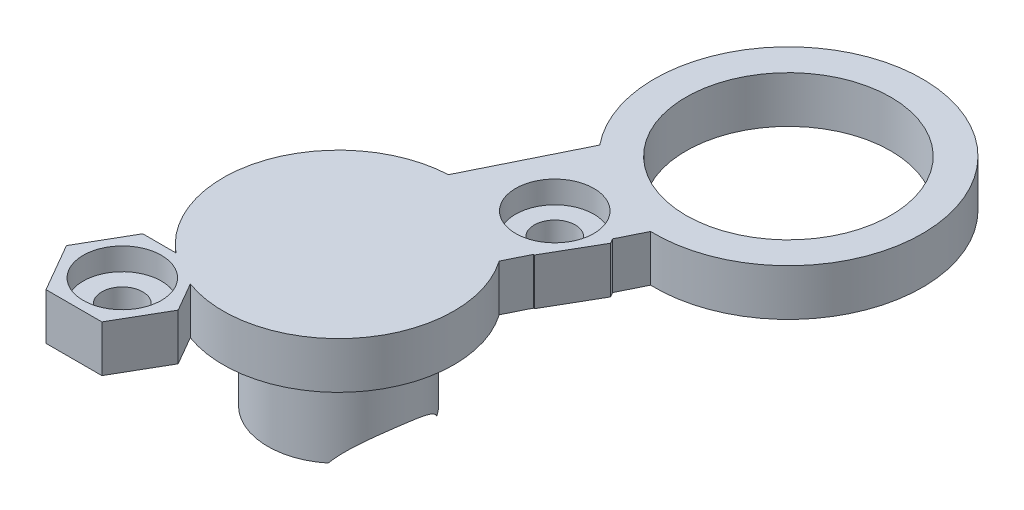
ISO-10303-21;
HEADER;
FILE_DESCRIPTION(('STEP AP214'),'2;1');
FILE_NAME('part.step','',(''),(''),'','','');
FILE_SCHEMA(('AUTOMOTIVE_DESIGN { 1 0 10303 214 1 1 1 1 }'));
ENDSEC;
DATA;
#1=APPLICATION_CONTEXT('core data for automotive mechanical design processes');
#2=APPLICATION_PROTOCOL_DEFINITION('international standard','automotive_design',2000,#1);
#3=PRODUCT_CONTEXT('',#1,'mechanical');
#4=PRODUCT('Part','Part','',(#3));
#5=PRODUCT_RELATED_PRODUCT_CATEGORY('part','',(#4));
#6=PRODUCT_DEFINITION_FORMATION('','',#4);
#7=PRODUCT_DEFINITION_CONTEXT('part definition',#1,'design');
#8=PRODUCT_DEFINITION('design','',#6,#7);
#9=PRODUCT_DEFINITION_SHAPE('','',#8);
#10=(LENGTH_UNIT() NAMED_UNIT(*) SI_UNIT(.MILLI.,.METRE.));
#11=(NAMED_UNIT(*) PLANE_ANGLE_UNIT() SI_UNIT($,.RADIAN.));
#12=(NAMED_UNIT(*) SI_UNIT($,.STERADIAN.) SOLID_ANGLE_UNIT());
#13=UNCERTAINTY_MEASURE_WITH_UNIT(LENGTH_MEASURE(1.E-05),#10,'distance_accuracy_value','');
#14=(GEOMETRIC_REPRESENTATION_CONTEXT(3) GLOBAL_UNCERTAINTY_ASSIGNED_CONTEXT((#13)) GLOBAL_UNIT_ASSIGNED_CONTEXT((#10,
#11,#12)) REPRESENTATION_CONTEXT('',''));
#15=CARTESIAN_POINT('',(0.,0.,0.));
#16=DIRECTION('',(0.,0.,1.));
#17=DIRECTION('',(1.,0.,0.));
#18=AXIS2_PLACEMENT_3D('',#15,#16,#17);
#19=CARTESIAN_POINT('',(-78.0224133595217,108.75,-22.3612159321677));
#20=DIRECTION('',(0.,-1.,0.));
#21=DIRECTION('',(0.,0.,1.));
#22=AXIS2_PLACEMENT_3D('',#19,#20,#21);
#23=CYLINDRICAL_SURFACE('',#22,1.1);
#24=CARTESIAN_POINT('',(-78.0224133595217,106.,-22.3612159321677));
#25=DIRECTION('',(0.,-1.,0.));
#26=DIRECTION('',(0.,0.,-1.));
#27=AXIS2_PLACEMENT_3D('',#24,#25,#26);
#28=CIRCLE('',#27,1.1);
#29=CARTESIAN_POINT('',(-78.0224133595217,106.,-23.4612159321677));
#30=VERTEX_POINT('',#29);
#31=EDGE_CURVE('E205',#30,#30,#28,.F.);
#32=ORIENTED_EDGE('',*,*,#31,.F.);
#33=EDGE_LOOP('',(#32));
#34=FACE_BOUND('',#33,.T.);
#35=CARTESIAN_POINT('',(-78.0224133595217,107.3,-22.3612159321677));
#36=DIRECTION('',(0.,-1.,0.));
#37=DIRECTION('',(0.,0.,-1.));
#38=AXIS2_PLACEMENT_3D('',#35,#36,#37);
#39=CIRCLE('',#38,1.1);
#40=CARTESIAN_POINT('',(-78.0224133595217,107.3,-23.4612159321677));
#41=VERTEX_POINT('',#40);
#42=EDGE_CURVE('E209',#41,#41,#39,.T.);
#43=ORIENTED_EDGE('',*,*,#42,.F.);
#44=EDGE_LOOP('',(#43));
#45=FACE_BOUND('',#44,.T.);
#46=ADVANCED_FACE('F41',(#34,#45),#23,.F.);
#47=CARTESIAN_POINT('',(-86.5224133595217,108.75,-7.63878406783227));
#48=DIRECTION('',(0.,-1.,0.));
#49=DIRECTION('',(0.,0.,1.));
#50=AXIS2_PLACEMENT_3D('',#47,#48,#49);
#51=CYLINDRICAL_SURFACE('',#50,1.1);
#52=CARTESIAN_POINT('',(-86.5224133595217,106.,-7.63878406783227));
#53=DIRECTION('',(0.,-1.,0.));
#54=DIRECTION('',(0.,0.,-1.));
#55=AXIS2_PLACEMENT_3D('',#52,#53,#54);
#56=CIRCLE('',#55,1.1);
#57=CARTESIAN_POINT('',(-86.5224133595217,106.,-8.73878406783227));
#58=VERTEX_POINT('',#57);
#59=EDGE_CURVE('E192',#58,#58,#56,.F.);
#60=ORIENTED_EDGE('',*,*,#59,.F.);
#61=EDGE_LOOP('',(#60));
#62=FACE_BOUND('',#61,.T.);
#63=CARTESIAN_POINT('',(-86.5224133595217,107.3,-7.63878406783227));
#64=DIRECTION('',(0.,-1.,0.));
#65=DIRECTION('',(0.,0.,-1.));
#66=AXIS2_PLACEMENT_3D('',#63,#64,#65);
#67=CIRCLE('',#66,1.1);
#68=CARTESIAN_POINT('',(-86.5224133595217,107.3,-8.73878406783227));
#69=VERTEX_POINT('',#68);
#70=EDGE_CURVE('E198',#69,#69,#67,.T.);
#71=ORIENTED_EDGE('',*,*,#70,.F.);
#72=EDGE_LOOP('',(#71));
#73=FACE_BOUND('',#72,.T.);
#74=ADVANCED_FACE('F355',(#62,#73),#51,.F.);
#75=CARTESIAN_POINT('',(-71.6012435520018,108.5,-29.8496216370886));
#76=DIRECTION('',(-0.89680256466223,0.,-0.442430966383737));
#77=DIRECTION('',(-0.442430966383737,0.,0.89680256466223));
#78=AXIS2_PLACEMENT_3D('',#75,#76,#77);
#79=PLANE('',#78);
#80=DIRECTION('',(0.,-1.,0.));
#81=VECTOR('',#80,1.);
#82=CARTESIAN_POINT('',(-74.49705477773,108.5,-23.9798450361482));
#83=LINE('',#82,#81);
#84=CARTESIAN_POINT('',(-74.49705477773,106.,-23.9798450361482));
#85=VERTEX_POINT('',#84);
#86=CARTESIAN_POINT('',(-74.49705477773,108.5,-23.9798450361482));
#87=VERTEX_POINT('',#86);
#88=EDGE_CURVE('E236',#85,#87,#83,.F.);
#89=ORIENTED_EDGE('',*,*,#88,.T.);
#90=DIRECTION('',(-0.442430966383737,0.,0.89680256466223));
#91=VECTOR('',#90,1.);
#92=CARTESIAN_POINT('',(-71.6012435520018,108.5,-29.8496216370886));
#93=LINE('',#92,#91);
#94=CARTESIAN_POINT('',(-75.1697204578679,108.5,-22.6163593108189));
#95=VERTEX_POINT('',#94);
#96=EDGE_CURVE('E234',#87,#95,#93,.T.);
#97=ORIENTED_EDGE('',*,*,#96,.T.);
#98=DIRECTION('',(0.,1.,0.));
#99=VECTOR('',#98,1.);
#100=CARTESIAN_POINT('',(-75.1697204578679,108.5,-22.6163593108189));
#101=LINE('',#100,#99);
#102=CARTESIAN_POINT('',(-75.1697204578679,106.,-22.6163593108189));
#103=VERTEX_POINT('',#102);
#104=EDGE_CURVE('E187',#103,#95,#101,.T.);
#105=ORIENTED_EDGE('',*,*,#104,.F.);
#106=DIRECTION('',(-0.442430966383737,0.,0.89680256466223));
#107=VECTOR('',#106,1.);
#108=CARTESIAN_POINT('',(-71.6012435520018,106.,-29.8496216370886));
#109=LINE('',#108,#107);
#110=EDGE_CURVE('E243',#85,#103,#109,.T.);
#111=ORIENTED_EDGE('',*,*,#110,.F.);
#112=EDGE_LOOP('',(#89,#97,#105,#111));
#113=FACE_BOUND('',#112,.T.);
#114=ADVANCED_FACE('F363',(#113),#79,.F.);
#115=CARTESIAN_POINT('',(-84.9628210535084,108.5,-16.3272928991512));
#116=DIRECTION('',(0.89680256466223,0.,0.442430966383737));
#117=DIRECTION('',(0.442430966383737,0.,-0.89680256466223));
#118=AXIS2_PLACEMENT_3D('',#115,#116,#117);
#119=PLANE('',#118);
#120=DIRECTION('',(0.,-1.,0.));
#121=VECTOR('',#120,1.);
#122=CARTESIAN_POINT('',(-79.8778701657034,108.5,-26.6344308344506));
#123=LINE('',#122,#121);
#124=CARTESIAN_POINT('',(-79.8778701657034,108.5,-26.6344308344506));
#125=VERTEX_POINT('',#124);
#126=CARTESIAN_POINT('',(-79.8778701657034,106.,-26.6344308344506));
#127=VERTEX_POINT('',#126);
#128=EDGE_CURVE('E49',#125,#127,#123,.T.);
#129=ORIENTED_EDGE('',*,*,#128,.T.);
#130=DIRECTION('',(0.442430966383737,0.,-0.89680256466223));
#131=VECTOR('',#130,1.);
#132=CARTESIAN_POINT('',(-84.9628210535084,106.,-16.3272928991512));
#133=LINE('',#132,#131);
#134=CARTESIAN_POINT('',(-82.5622508064944,106.,-21.193221637753));
#135=VERTEX_POINT('',#134);
#136=EDGE_CURVE('E252',#135,#127,#133,.T.);
#137=ORIENTED_EDGE('',*,*,#136,.F.);
#138=DIRECTION('',(0.,-1.,0.));
#139=VECTOR('',#138,1.);
#140=CARTESIAN_POINT('',(-82.5622508064944,108.5,-21.193221637753));
#141=LINE('',#140,#139);
#142=CARTESIAN_POINT('',(-82.5622508064944,108.5,-21.193221637753));
#143=VERTEX_POINT('',#142);
#144=EDGE_CURVE('E172',#143,#135,#141,.T.);
#145=ORIENTED_EDGE('',*,*,#144,.F.);
#146=DIRECTION('',(0.442430966383737,0.,-0.89680256466223));
#147=VECTOR('',#146,1.);
#148=CARTESIAN_POINT('',(-84.9628210535084,108.5,-16.3272928991512));
#149=LINE('',#148,#147);
#150=EDGE_CURVE('E233',#143,#125,#149,.T.);
#151=ORIENTED_EDGE('',*,*,#150,.T.);
#152=EDGE_LOOP('',(#129,#137,#145,#151));
#153=FACE_BOUND('',#152,.T.);
#154=ADVANCED_FACE('F239',(#153),#119,.F.);
#155=CARTESIAN_POINT('',(-82.2724133595217,108.5,-15.));
#156=DIRECTION('',(0.,-1.,0.));
#157=DIRECTION('',(0.,0.,1.));
#158=AXIS2_PLACEMENT_3D('',#155,#156,#157);
#159=CYLINDRICAL_SURFACE('',#158,6.2);
#160=DIRECTION('',(0.,-1.,0.));
#161=VECTOR('',#160,1.);
#162=CARTESIAN_POINT('',(-77.181435418521,108.5,-18.5386358394506));
#163=LINE('',#162,#161);
#164=CARTESIAN_POINT('',(-77.181435418521,106.,-18.5386358394506));
#165=VERTEX_POINT('',#164);
#166=CARTESIAN_POINT('',(-77.181435418521,108.5,-18.5386358394506));
#167=VERTEX_POINT('',#166);
#168=EDGE_CURVE('E179',#165,#167,#163,.F.);
#169=ORIENTED_EDGE('',*,*,#168,.T.);
#170=CARTESIAN_POINT('',(-82.2724133595217,108.5,-15.));
#171=DIRECTION('',(0.,-1.,0.));
#172=DIRECTION('',(0.,0.,-1.));
#173=AXIS2_PLACEMENT_3D('',#170,#171,#172);
#174=CIRCLE('',#173,6.2);
#175=CARTESIAN_POINT('',(-84.4129423972751,108.5,-9.18122560683656));
#176=VERTEX_POINT('',#175);
#177=EDGE_CURVE('E336',#167,#176,#174,.T.);
#178=ORIENTED_EDGE('',*,*,#177,.T.);
#179=DIRECTION('',(0.,-1.,0.));
#180=VECTOR('',#179,1.);
#181=CARTESIAN_POINT('',(-84.4129423972751,108.5,-9.18122560683656));
#182=LINE('',#181,#180);
#183=CARTESIAN_POINT('',(-84.4129423972751,106.,-9.18122560683656));
#184=VERTEX_POINT('',#183);
#185=EDGE_CURVE('E331',#176,#184,#182,.T.);
#186=ORIENTED_EDGE('',*,*,#185,.T.);
#187=CARTESIAN_POINT('',(-82.2724133595217,106.,-15.));
#188=DIRECTION('',(0.,-1.,0.));
#189=DIRECTION('',(0.,0.,-1.));
#190=AXIS2_PLACEMENT_3D('',#187,#188,#189);
#191=CIRCLE('',#190,6.2);
#192=EDGE_CURVE('E333',#165,#184,#191,.T.);
#193=ORIENTED_EDGE('',*,*,#192,.F.);
#194=EDGE_LOOP('',(#169,#178,#186,#193));
#195=FACE_BOUND('',#194,.T.);
#196=ADVANCED_FACE('F388',(#195),#159,.T.);
#197=ORIENTED_EDGE('',*,*,#144,.T.);
#198=CARTESIAN_POINT('',(-86.2413552840149,106.,-10.2368602791856));
#199=VERTEX_POINT('',#198);
#200=EDGE_CURVE('E251',#199,#135,#191,.T.);
#201=ORIENTED_EDGE('',*,*,#200,.F.);
#202=DIRECTION('',(0.,-1.,0.));
#203=VECTOR('',#202,1.);
#204=CARTESIAN_POINT('',(-86.2413552840149,108.5,-10.2368602791856));
#205=LINE('',#204,#203);
#206=CARTESIAN_POINT('',(-86.2413552840149,108.5,-10.2368602791856));
#207=VERTEX_POINT('',#206);
#208=EDGE_CURVE('E329',#199,#207,#205,.F.);
#209=ORIENTED_EDGE('',*,*,#208,.T.);
#210=EDGE_CURVE('E335',#207,#143,#174,.T.);
#211=ORIENTED_EDGE('',*,*,#210,.T.);
#212=EDGE_LOOP('',(#197,#201,#209,#211));
#213=FACE_BOUND('',#212,.T.);
#214=ADVANCED_FACE('F397',(#213),#159,.T.);
#215=CARTESIAN_POINT('',(-76.5224133595217,108.5,-19.7631397208144));
#216=DIRECTION('',(0.,0.,-1.));
#217=DIRECTION('',(-1.,0.,0.));
#218=AXIS2_PLACEMENT_3D('',#215,#216,#217);
#219=PLANE('',#218);
#220=DIRECTION('',(0.,-1.,0.));
#221=VECTOR('',#220,1.);
#222=CARTESIAN_POINT('',(-76.5773354115407,108.5,-19.7631397208144));
#223=LINE('',#222,#221);
#224=CARTESIAN_POINT('',(-76.5773354115407,108.5,-19.7631397208144));
#225=VERTEX_POINT('',#224);
#226=CARTESIAN_POINT('',(-76.5773354115407,106.,-19.7631397208144));
#227=VERTEX_POINT('',#226);
#228=EDGE_CURVE('E261',#225,#227,#223,.T.);
#229=ORIENTED_EDGE('',*,*,#228,.T.);
#230=DIRECTION('',(-1.,0.,0.));
#231=VECTOR('',#230,1.);
#232=CARTESIAN_POINT('',(-76.5224133595217,106.,-19.7631397208144));
#233=LINE('',#232,#231);
#234=CARTESIAN_POINT('',(-76.5224133595217,106.,-19.7631397208144));
#235=VERTEX_POINT('',#234);
#236=EDGE_CURVE('E270',#235,#227,#233,.T.);
#237=ORIENTED_EDGE('',*,*,#236,.F.);
#238=DIRECTION('',(0.,-1.,0.));
#239=VECTOR('',#238,1.);
#240=CARTESIAN_POINT('',(-76.5224133595217,108.5,-19.7631397208144));
#241=LINE('',#240,#239);
#242=CARTESIAN_POINT('',(-76.5224133595217,108.5,-19.7631397208144));
#243=VERTEX_POINT('',#242);
#244=EDGE_CURVE('E274',#243,#235,#241,.T.);
#245=ORIENTED_EDGE('',*,*,#244,.F.);
#246=DIRECTION('',(-1.,0.,0.));
#247=VECTOR('',#246,1.);
#248=CARTESIAN_POINT('',(-76.5224133595217,108.5,-19.7631397208144));
#249=LINE('',#248,#247);
#250=EDGE_CURVE('E275',#243,#225,#249,.T.);
#251=ORIENTED_EDGE('',*,*,#250,.T.);
#252=EDGE_LOOP('',(#229,#237,#245,#251));
#253=FACE_BOUND('',#252,.T.);
#254=ADVANCED_FACE('F394',(#253),#219,.F.);
#255=CARTESIAN_POINT('',(-76.5224133595217,108.5,-24.959292143521));
#256=DIRECTION('',(-0.86602540378444,0.,0.499999999999997));
#257=DIRECTION('',(0.499999999999997,0.,0.86602540378444));
#258=AXIS2_PLACEMENT_3D('',#255,#256,#257);
#259=PLANE('',#258);
#260=ORIENTED_EDGE('',*,*,#104,.T.);
#261=DIRECTION('',(0.499999999999997,0.,0.86602540378444));
#262=VECTOR('',#261,1.);
#263=CARTESIAN_POINT('',(-76.5224133595217,108.5,-24.959292143521));
#264=LINE('',#263,#262);
#265=CARTESIAN_POINT('',(-75.0224133595217,108.5,-22.3612159321677));
#266=VERTEX_POINT('',#265);
#267=EDGE_CURVE('E266',#95,#266,#264,.T.);
#268=ORIENTED_EDGE('',*,*,#267,.T.);
#269=DIRECTION('',(0.,-1.,0.));
#270=VECTOR('',#269,1.);
#271=CARTESIAN_POINT('',(-75.0224133595217,108.5,-22.3612159321677));
#272=LINE('',#271,#270);
#273=CARTESIAN_POINT('',(-75.0224133595217,106.,-22.3612159321677));
#274=VERTEX_POINT('',#273);
#275=EDGE_CURVE('E281',#266,#274,#272,.T.);
#276=ORIENTED_EDGE('',*,*,#275,.T.);
#277=DIRECTION('',(0.499999999999997,0.,0.86602540378444));
#278=VECTOR('',#277,1.);
#279=CARTESIAN_POINT('',(-76.5224133595217,106.,-24.959292143521));
#280=LINE('',#279,#278);
#281=EDGE_CURVE('E173',#103,#274,#280,.T.);
#282=ORIENTED_EDGE('',*,*,#281,.F.);
#283=EDGE_LOOP('',(#260,#268,#276,#282));
#284=FACE_BOUND('',#283,.T.);
#285=ADVANCED_FACE('F396',(#284),#259,.F.);
#286=CARTESIAN_POINT('',(-82.2724133595217,106.02,-15.));
#287=DIRECTION('',(0.,-1.,0.));
#288=DIRECTION('',(0.,0.,1.));
#289=AXIS2_PLACEMENT_3D('',#286,#287,#288);
#290=CYLINDRICAL_SURFACE('',#289,3.8);
#291=CARTESIAN_POINT('',(-82.2724133595217,101.,-15.));
#292=DIRECTION('',(0.,-1.,0.));
#293=DIRECTION('',(0.,0.,-1.));
#294=AXIS2_PLACEMENT_3D('',#291,#292,#293);
#295=CIRCLE('',#294,3.8);
#296=CARTESIAN_POINT('',(-79.8758974920685,101.,-12.0509812314864));
#297=VERTEX_POINT('',#296);
#298=CARTESIAN_POINT('',(-79.1484041425032,101.,-17.1634616733336));
#299=VERTEX_POINT('',#298);
#300=EDGE_CURVE('E340',#297,#299,#295,.T.);
#301=ORIENTED_EDGE('',*,*,#300,.F.);
#302=CARTESIAN_POINT('',(-79.148511180301,100.9998,-17.1636162262888));
#303=CARTESIAN_POINT('',(-79.1096706058397,101.072342110152,-17.1075839958387));
#304=CARTESIAN_POINT('',(-79.0704940078615,101.141737029236,-17.0477529523622));
#305=CARTESIAN_POINT('',(-78.9928844213158,101.2741615165,-16.9209783391261));
#306=CARTESIAN_POINT('',(-78.9544514477714,101.337190956191,-16.8540346258507));
#307=CARTESIAN_POINT('',(-78.8796991578984,101.456886305187,-16.7134331246445));
#308=CARTESIAN_POINT('',(-78.8433825792021,101.513544056817,-16.6397669435645));
#309=CARTESIAN_POINT('',(-78.7741584517933,101.620336946865,-16.4863669304504));
#310=CARTESIAN_POINT('',(-78.7412503376675,101.670473167461,-16.4066341086001));
#311=CARTESIAN_POINT('',(-78.6834994996304,101.75869968596,-16.2512989185493));
#312=CARTESIAN_POINT('',(-78.6581640478375,101.797512633648,-16.1762887878931));
#313=CARTESIAN_POINT('',(-78.6116903934059,101.86987515176,-16.0225241549786));
#314=CARTESIAN_POINT('',(-78.5905517670075,101.903425253509,-15.9437700317531));
#315=CARTESIAN_POINT('',(-78.5530886685602,101.96510164616,-15.7832046686248));
#316=CARTESIAN_POINT('',(-78.5367565914317,101.9932364806,-15.7013984914334));
#317=CARTESIAN_POINT('',(-78.5093551883445,102.044024535532,-15.5352397983401));
#318=CARTESIAN_POINT('',(-78.4982856260354,102.066678002182,-15.4508873969754));
#319=CARTESIAN_POINT('',(-78.4822131750876,102.105385136737,-15.2846135128402));
#320=CARTESIAN_POINT('',(-78.4769336368466,102.121713025434,-15.2027825673393));
#321=CARTESIAN_POINT('',(-78.471710135088,102.149229670343,-15.0380589479656));
#322=CARTESIAN_POINT('',(-78.4717681362095,102.160416532726,-14.9551658943775));
#323=CARTESIAN_POINT('',(-78.4773644569124,102.17756924396,-14.789039755793));
#324=CARTESIAN_POINT('',(-78.4829013510981,102.183536450003,-14.7058067648439));
#325=CARTESIAN_POINT('',(-78.4994724519996,102.190221249505,-14.5396696065829));
#326=CARTESIAN_POINT('',(-78.5105086070254,102.190936981028,-14.4567655663136));
#327=CARTESIAN_POINT('',(-78.5499904830626,102.185424591192,-14.2203506199849));
#328=CARTESIAN_POINT('',(-78.5852326703067,102.172629334172,-14.0680204194191));
#329=CARTESIAN_POINT('',(-78.6731837908015,102.128913957544,-13.771371905283));
#330=CARTESIAN_POINT('',(-78.7258880157063,102.09799872196,-13.627051444254));
#331=CARTESIAN_POINT('',(-78.8462400733784,102.018550534102,-13.3494615049712));
#332=CARTESIAN_POINT('',(-78.9139300643192,101.969967626041,-13.2162246918134));
#333=CARTESIAN_POINT('',(-79.0606200701408,101.855858350757,-12.9638976081357));
#334=CARTESIAN_POINT('',(-79.1396294327997,101.790317943255,-12.84481918013));
#335=CARTESIAN_POINT('',(-79.3100898808181,101.638024621455,-12.6153846596886));
#336=CARTESIAN_POINT('',(-79.4020183806665,101.550154500005,-12.5061281644802));
#337=CARTESIAN_POINT('',(-79.5876922550478,101.356314064967,-12.3072847617699));
#338=CARTESIAN_POINT('',(-79.6814338569042,101.250378363221,-12.2176609764649));
#339=CARTESIAN_POINT('',(-79.7900145651803,101.113686188711,-12.1228062049506));
#340=CARTESIAN_POINT('',(-79.8074033360684,101.091350519122,-12.1079005069893));
#341=CARTESIAN_POINT('',(-79.8419231429195,101.046051944822,-12.0788321321466));
#342=CARTESIAN_POINT('',(-79.8590544230849,101.023089701324,-12.0646687148022));
#343=CARTESIAN_POINT('',(-79.876043393218,100.9998,-12.0508626711191));
#344=B_SPLINE_CURVE_WITH_KNOTS('',3,(#302,#303,#304,#305,#306,#307,#308,#309,#310,#311,#312,
#313,#314,#315,#316,#317,#318,#319,#320,#321,#322,#323,#324,#325,#326,#327,#328,#329,#330,#331,
#332,#333,#334,#335,#336,#337,#338,#339,#340,#341,#342,#343),.UNSPECIFIED.,.F.,.F.,(4,2,2,2,2,2,
2,2,2,2,2,2,2,2,2,2,2,2,2,2,4),(0.,0.298502367110109,0.597010758387153,0.895897080679035,
1.19473374252968,1.45893687456311,1.72311331603081,1.98686949351789,2.25061382405023,
2.50111827840571,2.75171493870103,3.00224642058704,3.252866725392,3.72104449842142,
4.18909613775276,4.65848162776415,5.12825700492777,5.62913773764796,6.12906939821767,
6.2250353763368,6.3209037264417),.UNSPECIFIED.);
#345=EDGE_CURVE('E168',#299,#297,#344,.T.);
#346=ORIENTED_EDGE('',*,*,#345,.F.);
#347=EDGE_LOOP('',(#301,#346));
#348=FACE_BOUND('',#347,.T.);
#349=CARTESIAN_POINT('',(-82.2724133595217,106.,-15.));
#350=DIRECTION('',(0.,-1.,0.));
#351=DIRECTION('',(0.,0.,-1.));
#352=AXIS2_PLACEMENT_3D('',#349,#350,#351);
#353=CIRCLE('',#352,3.8);
#354=CARTESIAN_POINT('',(-82.2724133595217,106.,-18.8));
#355=VERTEX_POINT('',#354);
#356=EDGE_CURVE('E183',#355,#355,#353,.T.);
#357=ORIENTED_EDGE('',*,*,#356,.T.);
#358=EDGE_LOOP('',(#357));
#359=FACE_BOUND('',#358,.T.);
#360=ADVANCED_FACE('F43',(#348,#359),#290,.T.);
#361=CARTESIAN_POINT('',(-82.2724133595217,101.,-15.));
#362=DIRECTION('',(0.,1.,0.));
#363=DIRECTION('',(0.,0.,-1.));
#364=AXIS2_PLACEMENT_3D('',#361,#362,#363);
#365=PLANE('',#364);
#366=ORIENTED_EDGE('',*,*,#300,.T.);
#367=CARTESIAN_POINT('',(-79.8256121020381,101.,-14.6518262196257));
#368=DIRECTION('',(0.,-1.,0.));
#369=DIRECTION('',(0.990026908932881,0.,0.140878385811327));
#370=AXIS2_PLACEMENT_3D('',#367,#368,#369);
#371=ELLIPSE('',#370,5.40311255334571,2.58643522865266);
#372=CARTESIAN_POINT('',(-80.104367780033,101.,-17.285186724375));
#373=VERTEX_POINT('',#372);
#374=EDGE_CURVE('E167',#373,#299,#371,.T.);
#375=ORIENTED_EDGE('',*,*,#374,.F.);
#376=CARTESIAN_POINT('',(-82.2724133595217,101.,-15.));
#377=DIRECTION('',(0.,-1.,0.));
#378=DIRECTION('',(0.,0.,-1.));
#379=AXIS2_PLACEMENT_3D('',#376,#377,#378);
#380=CIRCLE('',#379,3.15);
#381=CARTESIAN_POINT('',(-80.8278704568208,101.,-12.2007508502713));
#382=VERTEX_POINT('',#381);
#383=EDGE_CURVE('E160',#382,#373,#380,.T.);
#384=ORIENTED_EDGE('',*,*,#383,.F.);
#385=EDGE_CURVE('E161',#297,#382,#371,.T.);
#386=ORIENTED_EDGE('',*,*,#385,.F.);
#387=EDGE_LOOP('',(#366,#375,#384,#386));
#388=FACE_BOUND('',#387,.T.);
#389=ADVANCED_FACE('F175',(#388),#365,.F.);
#390=CARTESIAN_POINT('',(-82.2724133595217,108.5,-15.));
#391=DIRECTION('',(0.,1.,0.));
#392=DIRECTION('',(0.,0.,-1.));
#393=AXIS2_PLACEMENT_3D('',#390,#391,#392);
#394=PLANE('',#393);
#395=CARTESIAN_POINT('',(-78.0224133595217,108.5,-22.3612159321677));
#396=DIRECTION('',(0.,-1.,0.));
#397=DIRECTION('',(0.,0.,-1.));
#398=AXIS2_PLACEMENT_3D('',#395,#396,#397);
#399=CIRCLE('',#398,2.1);
#400=CARTESIAN_POINT('',(-78.0224133595217,108.5,-24.4612159321677));
#401=VERTEX_POINT('',#400);
#402=EDGE_CURVE('E206',#401,#401,#399,.F.);
#403=ORIENTED_EDGE('',*,*,#402,.F.);
#404=EDGE_LOOP('',(#403));
#405=FACE_BOUND('',#404,.T.);
#406=CARTESIAN_POINT('',(-86.5224133595217,108.5,-7.63878406783227));
#407=DIRECTION('',(0.,-1.,0.));
#408=DIRECTION('',(0.,0.,-1.));
#409=AXIS2_PLACEMENT_3D('',#406,#407,#408);
#410=CIRCLE('',#409,2.1);
#411=CARTESIAN_POINT('',(-86.5224133595217,108.5,-9.73878406783228));
#412=VERTEX_POINT('',#411);
#413=EDGE_CURVE('E199',#412,#412,#410,.F.);
#414=ORIENTED_EDGE('',*,*,#413,.F.);
#415=EDGE_LOOP('',(#414));
#416=FACE_BOUND('',#415,.T.);
#417=CARTESIAN_POINT('',(-74.2916512459885,108.5,-31.1769145362398));
#418=DIRECTION('',(0.,-1.,0.));
#419=DIRECTION('',(0.,0.,-1.));
#420=AXIS2_PLACEMENT_3D('',#417,#418,#419);
#421=CIRCLE('',#420,5.50000000000001);
#422=CARTESIAN_POINT('',(-74.2916512459885,108.5,-25.6769145362398));
#423=VERTEX_POINT('',#422);
#424=EDGE_CURVE('E193',#423,#423,#421,.F.);
#425=ORIENTED_EDGE('',*,*,#424,.F.);
#426=EDGE_LOOP('',(#425));
#427=FACE_BOUND('',#426,.T.);
#428=CARTESIAN_POINT('',(-74.2916512459885,108.5,-31.1769145362398));
#429=DIRECTION('',(0.,-1.,0.));
#430=DIRECTION('',(0.,0.,-1.));
#431=AXIS2_PLACEMENT_3D('',#428,#429,#430);
#432=CIRCLE('',#431,7.2);
#433=EDGE_CURVE('E65',#125,#87,#432,.T.);
#434=ORIENTED_EDGE('',*,*,#433,.F.);
#435=ORIENTED_EDGE('',*,*,#150,.F.);
#436=ORIENTED_EDGE('',*,*,#210,.F.);
#437=DIRECTION('',(1.,0.,0.));
#438=VECTOR('',#437,1.);
#439=CARTESIAN_POINT('',(-88.0224133595217,108.5,-10.2368602791856));
#440=LINE('',#439,#438);
#441=CARTESIAN_POINT('',(-88.0224133595217,108.5,-10.2368602791856));
#442=VERTEX_POINT('',#441);
#443=EDGE_CURVE('E301',#442,#207,#440,.T.);
#444=ORIENTED_EDGE('',*,*,#443,.F.);
#445=DIRECTION('',(0.5,0.,-0.866025403784438));
#446=VECTOR('',#445,1.);
#447=CARTESIAN_POINT('',(-89.5224133595217,108.5,-7.63878406783227));
#448=LINE('',#447,#446);
#449=CARTESIAN_POINT('',(-89.5224133595217,108.5,-7.63878406783227));
#450=VERTEX_POINT('',#449);
#451=EDGE_CURVE('E296',#450,#442,#448,.T.);
#452=ORIENTED_EDGE('',*,*,#451,.F.);
#453=DIRECTION('',(-0.5,0.,-0.866025403784439));
#454=VECTOR('',#453,1.);
#455=CARTESIAN_POINT('',(-88.0224133595217,108.5,-5.04070785647895));
#456=LINE('',#455,#454);
#457=CARTESIAN_POINT('',(-88.0224133595217,108.5,-5.04070785647895));
#458=VERTEX_POINT('',#457);
#459=EDGE_CURVE('E294',#458,#450,#456,.T.);
#460=ORIENTED_EDGE('',*,*,#459,.F.);
#461=DIRECTION('',(-1.,0.,0.));
#462=VECTOR('',#461,1.);
#463=CARTESIAN_POINT('',(-85.0224133595217,108.5,-5.04070785647895));
#464=LINE('',#463,#462);
#465=CARTESIAN_POINT('',(-85.0224133595217,108.5,-5.04070785647895));
#466=VERTEX_POINT('',#465);
#467=EDGE_CURVE('E292',#466,#458,#464,.T.);
#468=ORIENTED_EDGE('',*,*,#467,.F.);
#469=DIRECTION('',(-0.5,0.,0.866025403784439));
#470=VECTOR('',#469,1.);
#471=CARTESIAN_POINT('',(-83.5224133595217,108.5,-7.63878406783227));
#472=LINE('',#471,#470);
#473=CARTESIAN_POINT('',(-83.5224133595217,108.5,-7.63878406783227));
#474=VERTEX_POINT('',#473);
#475=EDGE_CURVE('E289',#474,#466,#472,.T.);
#476=ORIENTED_EDGE('',*,*,#475,.F.);
#477=DIRECTION('',(0.5,0.,0.866025403784438));
#478=VECTOR('',#477,1.);
#479=CARTESIAN_POINT('',(-85.0224133595217,108.5,-10.2368602791856));
#480=LINE('',#479,#478);
#481=EDGE_CURVE('E285',#176,#474,#480,.T.);
#482=ORIENTED_EDGE('',*,*,#481,.F.);
#483=ORIENTED_EDGE('',*,*,#177,.F.);
#484=EDGE_CURVE('E245',#225,#167,#93,.T.);
#485=ORIENTED_EDGE('',*,*,#484,.F.);
#486=ORIENTED_EDGE('',*,*,#250,.F.);
#487=DIRECTION('',(-0.499999999999997,0.,0.866025403784441));
#488=VECTOR('',#487,1.);
#489=CARTESIAN_POINT('',(-75.0224133595217,108.5,-22.3612159321677));
#490=LINE('',#489,#488);
#491=EDGE_CURVE('E268',#266,#243,#490,.T.);
#492=ORIENTED_EDGE('',*,*,#491,.F.);
#493=ORIENTED_EDGE('',*,*,#267,.F.);
#494=ORIENTED_EDGE('',*,*,#96,.F.);
#495=EDGE_LOOP('',(#434,#435,#436,#444,#452,#460,#468,#476,#482,#483,#485,#486,#492,#493,#494));
#496=FACE_BOUND('',#495,.T.);
#497=ADVANCED_FACE('F219',(#405,#416,#427,#496),#394,.T.);
#498=CARTESIAN_POINT('',(-82.2724133595217,106.,-15.));
#499=DIRECTION('',(0.,1.,0.));
#500=DIRECTION('',(0.,0.,-1.));
#501=AXIS2_PLACEMENT_3D('',#498,#499,#500);
#502=PLANE('',#501);
#503=ORIENTED_EDGE('',*,*,#31,.T.);
#504=EDGE_LOOP('',(#503));
#505=FACE_BOUND('',#504,.T.);
#506=ORIENTED_EDGE('',*,*,#59,.T.);
#507=EDGE_LOOP('',(#506));
#508=FACE_BOUND('',#507,.T.);
#509=CARTESIAN_POINT('',(-74.2916512459885,106.,-31.1769145362398));
#510=DIRECTION('',(0.,-1.,0.));
#511=DIRECTION('',(0.,0.,-1.));
#512=AXIS2_PLACEMENT_3D('',#509,#510,#511);
#513=CIRCLE('',#512,5.50000000000001);
#514=CARTESIAN_POINT('',(-74.2916512459885,106.,-25.6769145362398));
#515=VERTEX_POINT('',#514);
#516=EDGE_CURVE('E194',#515,#515,#513,.F.);
#517=ORIENTED_EDGE('',*,*,#516,.T.);
#518=EDGE_LOOP('',(#517));
#519=FACE_BOUND('',#518,.T.);
#520=ORIENTED_EDGE('',*,*,#110,.T.);
#521=ORIENTED_EDGE('',*,*,#281,.T.);
#522=DIRECTION('',(-0.499999999999997,0.,0.866025403784441));
#523=VECTOR('',#522,1.);
#524=CARTESIAN_POINT('',(-75.0224133595217,106.,-22.3612159321677));
#525=LINE('',#524,#523);
#526=EDGE_CURVE('E180',#274,#235,#525,.T.);
#527=ORIENTED_EDGE('',*,*,#526,.T.);
#528=ORIENTED_EDGE('',*,*,#236,.T.);
#529=EDGE_CURVE('E253',#227,#165,#109,.T.);
#530=ORIENTED_EDGE('',*,*,#529,.T.);
#531=ORIENTED_EDGE('',*,*,#192,.T.);
#532=DIRECTION('',(0.5,0.,0.866025403784438));
#533=VECTOR('',#532,1.);
#534=CARTESIAN_POINT('',(-85.0224133595217,106.,-10.2368602791856));
#535=LINE('',#534,#533);
#536=CARTESIAN_POINT('',(-83.5224133595217,106.,-7.63878406783227));
#537=VERTEX_POINT('',#536);
#538=EDGE_CURVE('E283',#184,#537,#535,.T.);
#539=ORIENTED_EDGE('',*,*,#538,.T.);
#540=DIRECTION('',(-0.5,0.,0.866025403784439));
#541=VECTOR('',#540,1.);
#542=CARTESIAN_POINT('',(-83.5224133595217,106.,-7.63878406783227));
#543=LINE('',#542,#541);
#544=CARTESIAN_POINT('',(-85.0224133595217,106.,-5.04070785647895));
#545=VERTEX_POINT('',#544);
#546=EDGE_CURVE('E306',#537,#545,#543,.T.);
#547=ORIENTED_EDGE('',*,*,#546,.T.);
#548=DIRECTION('',(-1.,0.,0.));
#549=VECTOR('',#548,1.);
#550=CARTESIAN_POINT('',(-85.0224133595217,106.,-5.04070785647895));
#551=LINE('',#550,#549);
#552=CARTESIAN_POINT('',(-88.0224133595217,106.,-5.04070785647895));
#553=VERTEX_POINT('',#552);
#554=EDGE_CURVE('E307',#545,#553,#551,.T.);
#555=ORIENTED_EDGE('',*,*,#554,.T.);
#556=DIRECTION('',(-0.5,0.,-0.866025403784439));
#557=VECTOR('',#556,1.);
#558=CARTESIAN_POINT('',(-88.0224133595217,106.,-5.04070785647895));
#559=LINE('',#558,#557);
#560=CARTESIAN_POINT('',(-89.5224133595217,106.,-7.63878406783227));
#561=VERTEX_POINT('',#560);
#562=EDGE_CURVE('E315',#553,#561,#559,.T.);
#563=ORIENTED_EDGE('',*,*,#562,.T.);
#564=DIRECTION('',(0.5,0.,-0.866025403784438));
#565=VECTOR('',#564,1.);
#566=CARTESIAN_POINT('',(-89.5224133595217,106.,-7.63878406783227));
#567=LINE('',#566,#565);
#568=CARTESIAN_POINT('',(-88.0224133595217,106.,-10.2368602791856));
#569=VERTEX_POINT('',#568);
#570=EDGE_CURVE('E314',#561,#569,#567,.T.);
#571=ORIENTED_EDGE('',*,*,#570,.T.);
#572=DIRECTION('',(1.,0.,0.));
#573=VECTOR('',#572,1.);
#574=CARTESIAN_POINT('',(-88.0224133595217,106.,-10.2368602791856));
#575=LINE('',#574,#573);
#576=EDGE_CURVE('E288',#569,#199,#575,.T.);
#577=ORIENTED_EDGE('',*,*,#576,.T.);
#578=ORIENTED_EDGE('',*,*,#200,.T.);
#579=ORIENTED_EDGE('',*,*,#136,.T.);
#580=CARTESIAN_POINT('',(-74.2916512459885,106.,-31.1769145362398));
#581=DIRECTION('',(0.,-1.,0.));
#582=DIRECTION('',(0.,0.,-1.));
#583=AXIS2_PLACEMENT_3D('',#580,#581,#582);
#584=CIRCLE('',#583,7.2);
#585=EDGE_CURVE('E240',#127,#85,#584,.T.);
#586=ORIENTED_EDGE('',*,*,#585,.T.);
#587=EDGE_LOOP('',(#520,#521,#527,#528,#530,#531,#539,#547,#555,#563,#571,#577,#578,#579,#586));
#588=FACE_BOUND('',#587,.T.);
#589=ORIENTED_EDGE('',*,*,#356,.F.);
#590=EDGE_LOOP('',(#589));
#591=FACE_BOUND('',#590,.T.);
#592=ADVANCED_FACE('F221',(#505,#508,#519,#588,#591),#502,.F.);
#593=CARTESIAN_POINT('',(-85.0224133595217,108.5,-10.2368602791856));
#594=DIRECTION('',(-0.866025403784438,0.,0.5));
#595=DIRECTION('',(0.5,0.,0.866025403784438));
#596=AXIS2_PLACEMENT_3D('',#593,#594,#595);
#597=PLANE('',#596);
#598=ORIENTED_EDGE('',*,*,#481,.T.);
#599=DIRECTION('',(0.,-1.,0.));
#600=VECTOR('',#599,1.);
#601=CARTESIAN_POINT('',(-83.5224133595217,108.5,-7.63878406783227));
#602=LINE('',#601,#600);
#603=EDGE_CURVE('E326',#474,#537,#602,.T.);
#604=ORIENTED_EDGE('',*,*,#603,.T.);
#605=ORIENTED_EDGE('',*,*,#538,.F.);
#606=ORIENTED_EDGE('',*,*,#185,.F.);
#607=EDGE_LOOP('',(#598,#604,#605,#606));
#608=FACE_BOUND('',#607,.T.);
#609=ADVANCED_FACE('F345',(#608),#597,.F.);
#610=CARTESIAN_POINT('',(-88.0224133595217,108.5,-10.2368602791856));
#611=DIRECTION('',(0.,0.,1.));
#612=DIRECTION('',(1.,0.,0.));
#613=AXIS2_PLACEMENT_3D('',#610,#611,#612);
#614=PLANE('',#613);
#615=ORIENTED_EDGE('',*,*,#576,.F.);
#616=DIRECTION('',(0.,-1.,0.));
#617=VECTOR('',#616,1.);
#618=CARTESIAN_POINT('',(-88.0224133595217,108.5,-10.2368602791856));
#619=LINE('',#618,#617);
#620=EDGE_CURVE('E303',#442,#569,#619,.T.);
#621=ORIENTED_EDGE('',*,*,#620,.F.);
#622=ORIENTED_EDGE('',*,*,#443,.T.);
#623=ORIENTED_EDGE('',*,*,#208,.F.);
#624=EDGE_LOOP('',(#615,#621,#622,#623));
#625=FACE_BOUND('',#624,.T.);
#626=ADVANCED_FACE('F348',(#625),#614,.F.);
#627=CARTESIAN_POINT('',(-83.5224133595217,108.5,-7.63878406783227));
#628=DIRECTION('',(-0.866025403784438,0.,-0.5));
#629=DIRECTION('',(-0.5,0.,0.866025403784438));
#630=AXIS2_PLACEMENT_3D('',#627,#628,#629);
#631=PLANE('',#630);
#632=ORIENTED_EDGE('',*,*,#546,.F.);
#633=ORIENTED_EDGE('',*,*,#603,.F.);
#634=ORIENTED_EDGE('',*,*,#475,.T.);
#635=DIRECTION('',(0.,-1.,0.));
#636=VECTOR('',#635,1.);
#637=CARTESIAN_POINT('',(-85.0224133595217,108.5,-5.04070785647895));
#638=LINE('',#637,#636);
#639=EDGE_CURVE('E323',#466,#545,#638,.T.);
#640=ORIENTED_EDGE('',*,*,#639,.T.);
#641=EDGE_LOOP('',(#632,#633,#634,#640));
#642=FACE_BOUND('',#641,.T.);
#643=ADVANCED_FACE('F410',(#642),#631,.F.);
#644=CARTESIAN_POINT('',(-85.0224133595217,108.5,-5.04070785647895));
#645=DIRECTION('',(0.,0.,-1.));
#646=DIRECTION('',(-1.,0.,0.));
#647=AXIS2_PLACEMENT_3D('',#644,#645,#646);
#648=PLANE('',#647);
#649=ORIENTED_EDGE('',*,*,#554,.F.);
#650=ORIENTED_EDGE('',*,*,#639,.F.);
#651=ORIENTED_EDGE('',*,*,#467,.T.);
#652=DIRECTION('',(0.,-1.,0.));
#653=VECTOR('',#652,1.);
#654=CARTESIAN_POINT('',(-88.0224133595217,108.5,-5.04070785647895));
#655=LINE('',#654,#653);
#656=EDGE_CURVE('E321',#458,#553,#655,.T.);
#657=ORIENTED_EDGE('',*,*,#656,.T.);
#658=EDGE_LOOP('',(#649,#650,#651,#657));
#659=FACE_BOUND('',#658,.T.);
#660=ADVANCED_FACE('F416',(#659),#648,.F.);
#661=CARTESIAN_POINT('',(-88.0224133595217,108.5,-5.04070785647895));
#662=DIRECTION('',(0.866025403784438,0.,-0.5));
#663=DIRECTION('',(-0.5,0.,-0.866025403784438));
#664=AXIS2_PLACEMENT_3D('',#661,#662,#663);
#665=PLANE('',#664);
#666=ORIENTED_EDGE('',*,*,#562,.F.);
#667=ORIENTED_EDGE('',*,*,#656,.F.);
#668=ORIENTED_EDGE('',*,*,#459,.T.);
#669=DIRECTION('',(0.,-1.,0.));
#670=VECTOR('',#669,1.);
#671=CARTESIAN_POINT('',(-89.5224133595217,108.5,-7.63878406783227));
#672=LINE('',#671,#670);
#673=EDGE_CURVE('E318',#450,#561,#672,.T.);
#674=ORIENTED_EDGE('',*,*,#673,.T.);
#675=EDGE_LOOP('',(#666,#667,#668,#674));
#676=FACE_BOUND('',#675,.T.);
#677=ADVANCED_FACE('F412',(#676),#665,.F.);
#678=CARTESIAN_POINT('',(-89.5224133595217,108.5,-7.63878406783227));
#679=DIRECTION('',(0.866025403784438,0.,0.5));
#680=DIRECTION('',(0.5,0.,-0.866025403784438));
#681=AXIS2_PLACEMENT_3D('',#678,#679,#680);
#682=PLANE('',#681);
#683=ORIENTED_EDGE('',*,*,#570,.F.);
#684=ORIENTED_EDGE('',*,*,#673,.F.);
#685=ORIENTED_EDGE('',*,*,#451,.T.);
#686=ORIENTED_EDGE('',*,*,#620,.T.);
#687=EDGE_LOOP('',(#683,#684,#685,#686));
#688=FACE_BOUND('',#687,.T.);
#689=ADVANCED_FACE('F402',(#688),#682,.F.);
#690=CARTESIAN_POINT('',(-75.0224133595217,108.5,-22.3612159321677));
#691=DIRECTION('',(-0.866025403784441,0.,-0.499999999999997));
#692=DIRECTION('',(-0.499999999999997,0.,0.866025403784441));
#693=AXIS2_PLACEMENT_3D('',#690,#691,#692);
#694=PLANE('',#693);
#695=ORIENTED_EDGE('',*,*,#526,.F.);
#696=ORIENTED_EDGE('',*,*,#275,.F.);
#697=ORIENTED_EDGE('',*,*,#491,.T.);
#698=ORIENTED_EDGE('',*,*,#244,.T.);
#699=EDGE_LOOP('',(#695,#696,#697,#698));
#700=FACE_BOUND('',#699,.T.);
#701=ADVANCED_FACE('F392',(#700),#694,.F.);
#702=CARTESIAN_POINT('',(-82.2724133595217,101.,-15.));
#703=DIRECTION('',(0.,0.,-1.));
#704=DIRECTION('',(-1.,0.,0.));
#705=AXIS2_PLACEMENT_3D('',#702,#703,#704);
#706=SPHERICAL_SURFACE('',#705,3.15);
#707=ORIENTED_EDGE('',*,*,#383,.T.);
#708=CARTESIAN_POINT('',(-80.9895402163871,100.17230473673,-14.8174503177895));
#709=DIRECTION('',(0.834342962059054,-0.538308656109163,0.118724944390263));
#710=DIRECTION('',(0.542143136161945,0.840286153588461,0.));
#711=AXIS2_PLACEMENT_3D('',#708,#709,#710);
#712=CIRCLE('',#711,2.74924219800812);
#713=EDGE_CURVE('E11',#382,#373,#712,.F.);
#714=ORIENTED_EDGE('',*,*,#713,.F.);
#715=EDGE_LOOP('',(#707,#714));
#716=FACE_BOUND('',#715,.T.);
#717=ADVANCED_FACE('F159',(#716),#706,.F.);
#718=ORIENTED_EDGE('',*,*,#529,.F.);
#719=ORIENTED_EDGE('',*,*,#228,.F.);
#720=ORIENTED_EDGE('',*,*,#484,.T.);
#721=ORIENTED_EDGE('',*,*,#168,.F.);
#722=EDGE_LOOP('',(#718,#719,#720,#721));
#723=FACE_BOUND('',#722,.T.);
#724=ADVANCED_FACE('F384',(#723),#79,.F.);
#725=CARTESIAN_POINT('',(-74.2916512459885,108.5,-31.1769145362398));
#726=DIRECTION('',(0.,-1.,0.));
#727=DIRECTION('',(0.,0.,1.));
#728=AXIS2_PLACEMENT_3D('',#725,#726,#727);
#729=CYLINDRICAL_SURFACE('',#728,7.2);
#730=ORIENTED_EDGE('',*,*,#585,.F.);
#731=ORIENTED_EDGE('',*,*,#128,.F.);
#732=ORIENTED_EDGE('',*,*,#433,.T.);
#733=ORIENTED_EDGE('',*,*,#88,.F.);
#734=EDGE_LOOP('',(#730,#731,#732,#733));
#735=FACE_BOUND('',#734,.T.);
#736=ADVANCED_FACE('F244',(#735),#729,.T.);
#737=CARTESIAN_POINT('',(-74.2916512459885,108.6,-31.1769145362398));
#738=DIRECTION('',(0.,-1.,0.));
#739=DIRECTION('',(0.,0.,1.));
#740=AXIS2_PLACEMENT_3D('',#737,#738,#739);
#741=CYLINDRICAL_SURFACE('',#740,5.50000000000001);
#742=CARTESIAN_POINT('',(-74.2916512459885,108.5,-25.6769145362398));
#743=CARTESIAN_POINT('',(-74.2916512459885,108.473958333333,-25.6769145362398));
#744=CARTESIAN_POINT('',(-74.2916512459885,108.447916666667,-25.6769145362398));
#745=CARTESIAN_POINT('',(-74.2916512459885,108.395833333333,-25.6769145362398));
#746=CARTESIAN_POINT('',(-74.2916512459885,108.369791666667,-25.6769145362398));
#747=CARTESIAN_POINT('',(-74.2916512459885,108.317708333333,-25.6769145362398));
#748=CARTESIAN_POINT('',(-74.2916512459885,108.291666666667,-25.6769145362398));
#749=CARTESIAN_POINT('',(-74.2916512459885,108.239583333333,-25.6769145362398));
#750=CARTESIAN_POINT('',(-74.2916512459885,108.213541666667,-25.6769145362398));
#751=CARTESIAN_POINT('',(-74.2916512459885,108.161458333333,-25.6769145362398));
#752=CARTESIAN_POINT('',(-74.2916512459885,108.135416666667,-25.6769145362398));
#753=CARTESIAN_POINT('',(-74.2916512459885,108.083333333333,-25.6769145362398));
#754=CARTESIAN_POINT('',(-74.2916512459885,108.057291666667,-25.6769145362398));
#755=CARTESIAN_POINT('',(-74.2916512459885,108.005208333333,-25.6769145362398));
#756=CARTESIAN_POINT('',(-74.2916512459885,107.979166666667,-25.6769145362398));
#757=CARTESIAN_POINT('',(-74.2916512459885,107.927083333333,-25.6769145362398));
#758=CARTESIAN_POINT('',(-74.2916512459885,107.901041666667,-25.6769145362398));
#759=CARTESIAN_POINT('',(-74.2916512459885,107.848958333333,-25.6769145362398));
#760=CARTESIAN_POINT('',(-74.2916512459885,107.822916666667,-25.6769145362398));
#761=CARTESIAN_POINT('',(-74.2916512459885,107.770833333333,-25.6769145362398));
#762=CARTESIAN_POINT('',(-74.2916512459885,107.744791666667,-25.6769145362398));
#763=CARTESIAN_POINT('',(-74.2916512459885,107.692708333333,-25.6769145362398));
#764=CARTESIAN_POINT('',(-74.2916512459885,107.666666666667,-25.6769145362398));
#765=CARTESIAN_POINT('',(-74.2916512459885,107.614583333333,-25.6769145362398));
#766=CARTESIAN_POINT('',(-74.2916512459885,107.588541666667,-25.6769145362398));
#767=CARTESIAN_POINT('',(-74.2916512459885,107.536458333333,-25.6769145362398));
#768=CARTESIAN_POINT('',(-74.2916512459885,107.510416666667,-25.6769145362398));
#769=CARTESIAN_POINT('',(-74.2916512459885,107.458333333333,-25.6769145362398));
#770=CARTESIAN_POINT('',(-74.2916512459885,107.432291666667,-25.6769145362398));
#771=CARTESIAN_POINT('',(-74.2916512459885,107.380208333333,-25.6769145362398));
#772=CARTESIAN_POINT('',(-74.2916512459885,107.354166666667,-25.6769145362398));
#773=CARTESIAN_POINT('',(-74.2916512459885,107.302083333333,-25.6769145362398));
#774=CARTESIAN_POINT('',(-74.2916512459885,107.276041666667,-25.6769145362398));
#775=CARTESIAN_POINT('',(-74.2916512459885,107.223958333333,-25.6769145362398));
#776=CARTESIAN_POINT('',(-74.2916512459885,107.197916666667,-25.6769145362398));
#777=CARTESIAN_POINT('',(-74.2916512459885,107.145833333333,-25.6769145362398));
#778=CARTESIAN_POINT('',(-74.2916512459885,107.119791666667,-25.6769145362398));
#779=CARTESIAN_POINT('',(-74.2916512459885,107.067708333333,-25.6769145362398));
#780=CARTESIAN_POINT('',(-74.2916512459885,107.041666666667,-25.6769145362398));
#781=CARTESIAN_POINT('',(-74.2916512459885,106.989583333333,-25.6769145362398));
#782=CARTESIAN_POINT('',(-74.2916512459885,106.963541666667,-25.6769145362398));
#783=CARTESIAN_POINT('',(-74.2916512459885,106.911458333333,-25.6769145362398));
#784=CARTESIAN_POINT('',(-74.2916512459885,106.885416666667,-25.6769145362398));
#785=CARTESIAN_POINT('',(-74.2916512459885,106.833333333333,-25.6769145362398));
#786=CARTESIAN_POINT('',(-74.2916512459885,106.807291666667,-25.6769145362398));
#787=CARTESIAN_POINT('',(-74.2916512459885,106.755208333333,-25.6769145362398));
#788=CARTESIAN_POINT('',(-74.2916512459885,106.729166666667,-25.6769145362398));
#789=CARTESIAN_POINT('',(-74.2916512459885,106.677083333333,-25.6769145362398));
#790=CARTESIAN_POINT('',(-74.2916512459885,106.651041666667,-25.6769145362398));
#791=CARTESIAN_POINT('',(-74.2916512459885,106.598958333333,-25.6769145362398));
#792=CARTESIAN_POINT('',(-74.2916512459885,106.572916666667,-25.6769145362398));
#793=CARTESIAN_POINT('',(-74.2916512459885,106.520833333333,-25.6769145362398));
#794=CARTESIAN_POINT('',(-74.2916512459885,106.494791666667,-25.6769145362398));
#795=CARTESIAN_POINT('',(-74.2916512459885,106.442708333333,-25.6769145362398));
#796=CARTESIAN_POINT('',(-74.2916512459885,106.416666666667,-25.6769145362398));
#797=CARTESIAN_POINT('',(-74.2916512459885,106.364583333333,-25.6769145362398));
#798=CARTESIAN_POINT('',(-74.2916512459885,106.338541666667,-25.6769145362398));
#799=CARTESIAN_POINT('',(-74.2916512459885,106.286458333333,-25.6769145362398));
#800=CARTESIAN_POINT('',(-74.2916512459885,106.260416666667,-25.6769145362398));
#801=CARTESIAN_POINT('',(-74.2916512459885,106.208333333333,-25.6769145362398));
#802=CARTESIAN_POINT('',(-74.2916512459885,106.182291666667,-25.6769145362398));
#803=CARTESIAN_POINT('',(-74.2916512459885,106.130208333333,-25.6769145362398));
#804=CARTESIAN_POINT('',(-74.2916512459885,106.104166666667,-25.6769145362398));
#805=CARTESIAN_POINT('',(-74.2916512459885,106.052083333333,-25.6769145362398));
#806=CARTESIAN_POINT('',(-74.2916512459885,106.026041666667,-25.6769145362398));
#807=CARTESIAN_POINT('',(-74.2916512459885,106.,-25.6769145362398));
#808=B_SPLINE_CURVE_WITH_KNOTS('',3,(#742,#743,#744,#745,#746,#747,#748,#749,#750,#751,#752,
#753,#754,#755,#756,#757,#758,#759,#760,#761,#762,#763,#764,#765,#766,#767,#768,#769,#770,#771,
#772,#773,#774,#775,#776,#777,#778,#779,#780,#781,#782,#783,#784,#785,#786,#787,#788,#789,#790,
#791,#792,#793,#794,#795,#796,#797,#798,#799,#800,#801,#802,#803,#804,#805,#806,#807),
.UNSPECIFIED.,.F.,.F.,(4,2,2,2,2,2,2,2,2,2,2,2,2,2,2,2,2,2,2,2,2,2,2,2,2,2,2,2,2,2,2,2,4),(0.,
0.0781249999999983,0.156249999999997,0.234374999999995,0.312499999999993,0.390624999999992,
0.46874999999999,0.546874999999988,0.625000000000001,0.703124999999999,0.781249999999997,
0.859374999999996,0.937499999999994,1.01562499999999,1.09374999999999,1.17187499999999,1.25,
1.328125,1.40625,1.484375,1.56249999999999,1.64062499999999,1.71874999999999,1.79687499999999,
1.875,1.953125,2.03125,2.109375,2.1875,2.26562499999999,2.34374999999999,2.42187499999999,2.5),.UNSPECIFIED.);
#809=EDGE_CURVE('BSEAM374',#423,#515,#808,.T.);
#810=ORIENTED_EDGE('',*,*,#424,.T.);
#811=ORIENTED_EDGE('',*,*,#516,.F.);
#812=ORIENTED_EDGE('',*,*,#809,.T.);
#813=ORIENTED_EDGE('',*,*,#809,.F.);
#814=EDGE_LOOP('',(#810,#812,#811,#813));
#815=FACE_BOUND('',#814,.T.);
#816=ADVANCED_FACE('F374',(#815),#741,.F.);
#817=CARTESIAN_POINT('',(-86.5224133595217,108.75,-7.63878406783227));
#818=DIRECTION('',(0.,-1.,0.));
#819=DIRECTION('',(0.,0.,1.));
#820=AXIS2_PLACEMENT_3D('',#817,#818,#819);
#821=CYLINDRICAL_SURFACE('',#820,2.1);
#822=ORIENTED_EDGE('',*,*,#413,.T.);
#823=EDGE_LOOP('',(#822));
#824=FACE_BOUND('',#823,.T.);
#825=CARTESIAN_POINT('',(-86.5224133595217,107.3,-7.63878406783227));
#826=DIRECTION('',(0.,-1.,0.));
#827=DIRECTION('',(0.,0.,-1.));
#828=AXIS2_PLACEMENT_3D('',#825,#826,#827);
#829=CIRCLE('',#828,2.1);
#830=CARTESIAN_POINT('',(-86.5224133595217,107.3,-9.73878406783228));
#831=VERTEX_POINT('',#830);
#832=EDGE_CURVE('E202',#831,#831,#829,.T.);
#833=ORIENTED_EDGE('',*,*,#832,.T.);
#834=EDGE_LOOP('',(#833));
#835=FACE_BOUND('',#834,.T.);
#836=ADVANCED_FACE('F375',(#824,#835),#821,.F.);
#837=CARTESIAN_POINT('',(-86.5224133595217,107.3,-7.63878406783227));
#838=DIRECTION('',(0.,1.,0.));
#839=DIRECTION('',(0.,0.,-1.));
#840=AXIS2_PLACEMENT_3D('',#837,#838,#839);
#841=PLANE('',#840);
#842=ORIENTED_EDGE('',*,*,#70,.T.);
#843=EDGE_LOOP('',(#842));
#844=FACE_BOUND('',#843,.T.);
#845=ORIENTED_EDGE('',*,*,#832,.F.);
#846=EDGE_LOOP('',(#845));
#847=FACE_BOUND('',#846,.T.);
#848=ADVANCED_FACE('F367',(#844,#847),#841,.T.);
#849=CARTESIAN_POINT('',(-78.0224133595217,108.75,-22.3612159321677));
#850=DIRECTION('',(0.,-1.,0.));
#851=DIRECTION('',(0.,0.,1.));
#852=AXIS2_PLACEMENT_3D('',#849,#850,#851);
#853=CYLINDRICAL_SURFACE('',#852,2.1);
#854=ORIENTED_EDGE('',*,*,#402,.T.);
#855=EDGE_LOOP('',(#854));
#856=FACE_BOUND('',#855,.T.);
#857=CARTESIAN_POINT('',(-78.0224133595217,107.3,-22.3612159321677));
#858=DIRECTION('',(0.,-1.,0.));
#859=DIRECTION('',(0.,0.,-1.));
#860=AXIS2_PLACEMENT_3D('',#857,#858,#859);
#861=CIRCLE('',#860,2.1);
#862=CARTESIAN_POINT('',(-78.0224133595217,107.3,-24.4612159321677));
#863=VERTEX_POINT('',#862);
#864=EDGE_CURVE('E214',#863,#863,#861,.T.);
#865=ORIENTED_EDGE('',*,*,#864,.T.);
#866=EDGE_LOOP('',(#865));
#867=FACE_BOUND('',#866,.T.);
#868=ADVANCED_FACE('F212',(#856,#867),#853,.F.);
#869=CARTESIAN_POINT('',(-78.0224133595217,107.3,-22.3612159321677));
#870=DIRECTION('',(0.,1.,0.));
#871=DIRECTION('',(0.,0.,-1.));
#872=AXIS2_PLACEMENT_3D('',#869,#870,#871);
#873=PLANE('',#872);
#874=ORIENTED_EDGE('',*,*,#42,.T.);
#875=EDGE_LOOP('',(#874));
#876=FACE_BOUND('',#875,.T.);
#877=ORIENTED_EDGE('',*,*,#864,.F.);
#878=EDGE_LOOP('',(#877));
#879=FACE_BOUND('',#878,.T.);
#880=ADVANCED_FACE('F465',(#876,#879),#873,.T.);
#881=CARTESIAN_POINT('',(-82.2724133595217,101.,-15.));
#882=DIRECTION('',(0.834342962059054,-0.538308656109163,0.118724944390263));
#883=DIRECTION('',(-0.542143136161945,-0.840286153588461,0.));
#884=AXIS2_PLACEMENT_3D('',#881,#882,#883);
#885=CONICAL_SURFACE('',#884,2.3,0.284261523704203);
#886=ORIENTED_EDGE('',*,*,#374,.T.);
#887=ORIENTED_EDGE('',*,*,#345,.T.);
#888=ORIENTED_EDGE('',*,*,#385,.T.);
#889=ORIENTED_EDGE('',*,*,#713,.T.);
#890=EDGE_LOOP('',(#886,#887,#888,#889));
#891=FACE_BOUND('',#890,.T.);
#892=ADVANCED_FACE('F165',(#891),#885,.F.);
#893=CLOSED_SHELL('',(#46,#74,#114,#154,#196,#214,#254,#285,#360,#389,#497,#592,#609,#626,#643,
#660,#677,#689,#701,#717,#724,#736,#816,#836,#848,#868,#880,#892));
#894=MANIFOLD_SOLID_BREP('B2',#893);
#895=ADVANCED_BREP_SHAPE_REPRESENTATION('',(#18,#894),#14);
#896=SHAPE_DEFINITION_REPRESENTATION(#9,#895);
ENDSEC;
END-ISO-10303-21;
